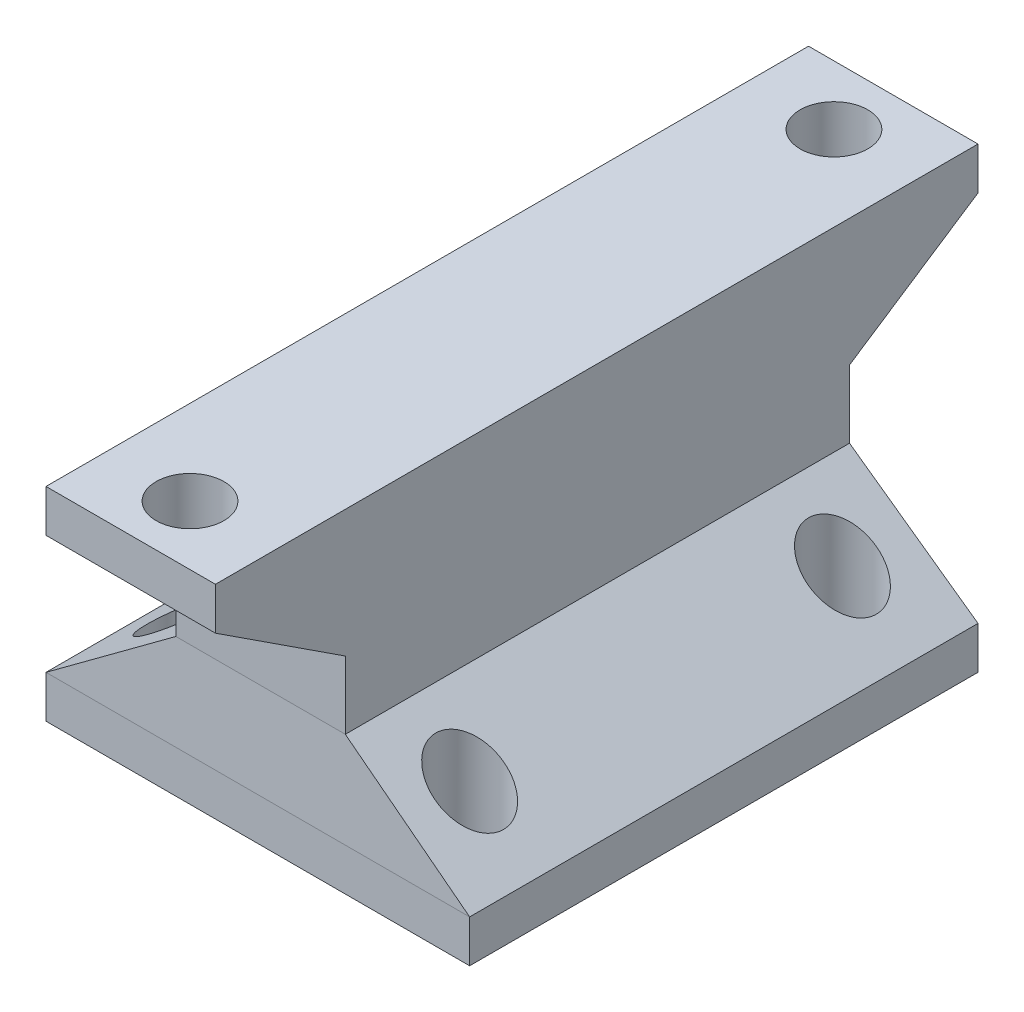
ISO-10303-21;
HEADER;
FILE_DESCRIPTION(('STEP AP214'),'2;1');
FILE_NAME('part.step','',(''),(''),'','','');
FILE_SCHEMA(('AUTOMOTIVE_DESIGN { 1 0 10303 214 1 1 1 1 }'));
ENDSEC;
DATA;
#1=APPLICATION_CONTEXT('core data for automotive mechanical design processes');
#2=APPLICATION_PROTOCOL_DEFINITION('international standard','automotive_design',2000,#1);
#3=PRODUCT_CONTEXT('',#1,'mechanical');
#4=PRODUCT('Part','Part','',(#3));
#5=PRODUCT_RELATED_PRODUCT_CATEGORY('part','',(#4));
#6=PRODUCT_DEFINITION_FORMATION('','',#4);
#7=PRODUCT_DEFINITION_CONTEXT('part definition',#1,'design');
#8=PRODUCT_DEFINITION('design','',#6,#7);
#9=PRODUCT_DEFINITION_SHAPE('','',#8);
#10=(LENGTH_UNIT() NAMED_UNIT(*) SI_UNIT(.MILLI.,.METRE.));
#11=(NAMED_UNIT(*) PLANE_ANGLE_UNIT() SI_UNIT($,.RADIAN.));
#12=(NAMED_UNIT(*) SI_UNIT($,.STERADIAN.) SOLID_ANGLE_UNIT());
#13=UNCERTAINTY_MEASURE_WITH_UNIT(LENGTH_MEASURE(1.E-05),#10,'distance_accuracy_value','');
#14=(GEOMETRIC_REPRESENTATION_CONTEXT(3) GLOBAL_UNCERTAINTY_ASSIGNED_CONTEXT((#13)) GLOBAL_UNIT_ASSIGNED_CONTEXT((#10,
#11,#12)) REPRESENTATION_CONTEXT('',''));
#15=CARTESIAN_POINT('',(0.,0.,0.));
#16=DIRECTION('',(0.,0.,1.));
#17=DIRECTION('',(1.,0.,0.));
#18=AXIS2_PLACEMENT_3D('',#15,#16,#17);
#19=CARTESIAN_POINT('',(-25.,-33.999664598733,-30.));
#20=DIRECTION('',(1.,0.,0.));
#21=DIRECTION('',(0.,0.,-1.));
#22=AXIS2_PLACEMENT_3D('',#19,#20,#21);
#23=PLANE('',#22);
#24=DIRECTION('',(0.,0.,-1.));
#25=VECTOR('',#24,1.);
#26=CARTESIAN_POINT('',(-25.,-28.999664598733,-30.));
#27=LINE('',#26,#25);
#28=CARTESIAN_POINT('',(-25.,-28.999664598733,30.));
#29=VERTEX_POINT('',#28);
#30=CARTESIAN_POINT('',(-25.,-28.999664598733,-30.));
#31=VERTEX_POINT('',#30);
#32=EDGE_CURVE('E90',#29,#31,#27,.T.);
#33=ORIENTED_EDGE('',*,*,#32,.T.);
#34=DIRECTION('',(0.,1.,0.));
#35=VECTOR('',#34,1.);
#36=CARTESIAN_POINT('',(-25.,-33.999664598733,-30.));
#37=LINE('',#36,#35);
#38=CARTESIAN_POINT('',(-25.,-33.999664598733,-30.));
#39=VERTEX_POINT('',#38);
#40=EDGE_CURVE('E12',#39,#31,#37,.T.);
#41=ORIENTED_EDGE('',*,*,#40,.F.);
#42=DIRECTION('',(0.,0.,-1.));
#43=VECTOR('',#42,1.);
#44=CARTESIAN_POINT('',(-25.,-33.999664598733,-30.));
#45=LINE('',#44,#43);
#46=CARTESIAN_POINT('',(-25.,-33.999664598733,30.));
#47=VERTEX_POINT('',#46);
#48=EDGE_CURVE('E120',#47,#39,#45,.T.);
#49=ORIENTED_EDGE('',*,*,#48,.F.);
#50=DIRECTION('',(0.,1.,0.));
#51=VECTOR('',#50,1.);
#52=CARTESIAN_POINT('',(-25.,-33.999664598733,30.));
#53=LINE('',#52,#51);
#54=EDGE_CURVE('E136',#47,#29,#53,.T.);
#55=ORIENTED_EDGE('',*,*,#54,.T.);
#56=EDGE_LOOP('',(#33,#41,#49,#55));
#57=FACE_BOUND('',#56,.T.);
#58=ADVANCED_FACE('F46',(#57),#23,.F.);
#59=CARTESIAN_POINT('',(25.,-33.999664598733,-30.));
#60=DIRECTION('',(0.,0.,1.));
#61=DIRECTION('',(0.,-1.,0.));
#62=AXIS2_PLACEMENT_3D('',#59,#60,#61);
#63=PLANE('',#62);
#64=DIRECTION('',(1.,0.,0.));
#65=VECTOR('',#64,1.);
#66=CARTESIAN_POINT('',(25.,-28.999664598733,-30.));
#67=LINE('',#66,#65);
#68=CARTESIAN_POINT('',(25.,-28.999664598733,-30.));
#69=VERTEX_POINT('',#68);
#70=EDGE_CURVE('E128',#31,#69,#67,.T.);
#71=ORIENTED_EDGE('',*,*,#70,.T.);
#72=DIRECTION('',(0.,1.,0.));
#73=VECTOR('',#72,1.);
#74=CARTESIAN_POINT('',(25.,-33.999664598733,-30.));
#75=LINE('',#74,#73);
#76=CARTESIAN_POINT('',(25.,-33.999664598733,-30.));
#77=VERTEX_POINT('',#76);
#78=EDGE_CURVE('E55',#77,#69,#75,.T.);
#79=ORIENTED_EDGE('',*,*,#78,.F.);
#80=DIRECTION('',(1.,0.,0.));
#81=VECTOR('',#80,1.);
#82=CARTESIAN_POINT('',(25.,-33.999664598733,-30.));
#83=LINE('',#82,#81);
#84=EDGE_CURVE('E113',#39,#77,#83,.T.);
#85=ORIENTED_EDGE('',*,*,#84,.F.);
#86=ORIENTED_EDGE('',*,*,#40,.T.);
#87=EDGE_LOOP('',(#71,#79,#85,#86));
#88=FACE_BOUND('',#87,.T.);
#89=ADVANCED_FACE('F126',(#88),#63,.F.);
#90=CARTESIAN_POINT('',(25.,-33.999664598733,-30.));
#91=DIRECTION('',(-1.,0.,0.));
#92=DIRECTION('',(0.,0.,1.));
#93=AXIS2_PLACEMENT_3D('',#90,#91,#92);
#94=PLANE('',#93);
#95=DIRECTION('',(0.,0.,1.));
#96=VECTOR('',#95,1.);
#97=CARTESIAN_POINT('',(25.,-28.999664598733,-30.));
#98=LINE('',#97,#96);
#99=CARTESIAN_POINT('',(25.,-28.999664598733,30.));
#100=VERTEX_POINT('',#99);
#101=EDGE_CURVE('E146',#69,#100,#98,.T.);
#102=ORIENTED_EDGE('',*,*,#101,.T.);
#103=DIRECTION('',(0.,1.,0.));
#104=VECTOR('',#103,1.);
#105=CARTESIAN_POINT('',(25.,-33.999664598733,30.));
#106=LINE('',#105,#104);
#107=CARTESIAN_POINT('',(25.,-33.999664598733,30.));
#108=VERTEX_POINT('',#107);
#109=EDGE_CURVE('E131',#108,#100,#106,.T.);
#110=ORIENTED_EDGE('',*,*,#109,.F.);
#111=DIRECTION('',(0.,0.,1.));
#112=VECTOR('',#111,1.);
#113=CARTESIAN_POINT('',(25.,-33.999664598733,-30.));
#114=LINE('',#113,#112);
#115=EDGE_CURVE('E117',#77,#108,#114,.T.);
#116=ORIENTED_EDGE('',*,*,#115,.F.);
#117=ORIENTED_EDGE('',*,*,#78,.T.);
#118=EDGE_LOOP('',(#102,#110,#116,#117));
#119=FACE_BOUND('',#118,.T.);
#120=ADVANCED_FACE('F133',(#119),#94,.F.);
#121=CARTESIAN_POINT('',(25.,-33.999664598733,30.));
#122=DIRECTION('',(0.,0.,-1.));
#123=DIRECTION('',(0.,1.,0.));
#124=AXIS2_PLACEMENT_3D('',#121,#122,#123);
#125=PLANE('',#124);
#126=DIRECTION('',(1.,0.,0.));
#127=VECTOR('',#126,1.);
#128=CARTESIAN_POINT('',(25.,-28.999664598733,30.));
#129=LINE('',#128,#127);
#130=EDGE_CURVE('E83',#100,#29,#129,.F.);
#131=ORIENTED_EDGE('',*,*,#130,.T.);
#132=ORIENTED_EDGE('',*,*,#54,.F.);
#133=DIRECTION('',(-1.,0.,0.));
#134=VECTOR('',#133,1.);
#135=CARTESIAN_POINT('',(25.,-33.999664598733,30.));
#136=LINE('',#135,#134);
#137=EDGE_CURVE('E64',#108,#47,#136,.T.);
#138=ORIENTED_EDGE('',*,*,#137,.F.);
#139=ORIENTED_EDGE('',*,*,#109,.T.);
#140=EDGE_LOOP('',(#131,#132,#138,#139));
#141=FACE_BOUND('',#140,.T.);
#142=ADVANCED_FACE('F398',(#141),#125,.F.);
#143=CARTESIAN_POINT('',(0.,-33.999664598733,0.));
#144=DIRECTION('',(0.,-1.,0.));
#145=DIRECTION('',(0.,0.,-1.));
#146=AXIS2_PLACEMENT_3D('',#143,#144,#145);
#147=PLANE('',#146);
#148=CARTESIAN_POINT('',(0.,-33.999664598733,0.));
#149=DIRECTION('',(0.,-1.,0.));
#150=DIRECTION('',(0.,0.,-1.));
#151=AXIS2_PLACEMENT_3D('',#148,#149,#150);
#152=CIRCLE('',#151,5.);
#153=CARTESIAN_POINT('',(0.,-33.999664598733,-5.00000000000001));
#154=VERTEX_POINT('',#153);
#155=EDGE_CURVE('E276',#154,#154,#152,.T.);
#156=ORIENTED_EDGE('',*,*,#155,.F.);
#157=EDGE_LOOP('',(#156));
#158=FACE_BOUND('',#157,.T.);
#159=CARTESIAN_POINT('',(17.,-33.999664598733,22.));
#160=DIRECTION('',(0.,-1.,0.));
#161=DIRECTION('',(0.,0.,-1.));
#162=AXIS2_PLACEMENT_3D('',#159,#160,#161);
#163=CIRCLE('',#162,4.);
#164=CARTESIAN_POINT('',(17.,-33.999664598733,18.));
#165=VERTEX_POINT('',#164);
#166=EDGE_CURVE('E221',#165,#165,#163,.F.);
#167=ORIENTED_EDGE('',*,*,#166,.T.);
#168=EDGE_LOOP('',(#167));
#169=FACE_BOUND('',#168,.T.);
#170=CARTESIAN_POINT('',(-17.,-33.999664598733,-22.));
#171=DIRECTION('',(0.,-1.,0.));
#172=DIRECTION('',(0.,0.,-1.));
#173=AXIS2_PLACEMENT_3D('',#170,#171,#172);
#174=CIRCLE('',#173,4.);
#175=CARTESIAN_POINT('',(-17.,-33.999664598733,-26.));
#176=VERTEX_POINT('',#175);
#177=EDGE_CURVE('E254',#176,#176,#174,.F.);
#178=ORIENTED_EDGE('',*,*,#177,.T.);
#179=EDGE_LOOP('',(#178));
#180=FACE_BOUND('',#179,.T.);
#181=CARTESIAN_POINT('',(17.,-33.999664598733,-22.));
#182=DIRECTION('',(0.,-1.,0.));
#183=DIRECTION('',(0.,0.,-1.));
#184=AXIS2_PLACEMENT_3D('',#181,#182,#183);
#185=CIRCLE('',#184,4.);
#186=CARTESIAN_POINT('',(17.,-33.999664598733,-26.));
#187=VERTEX_POINT('',#186);
#188=EDGE_CURVE('E258',#187,#187,#185,.F.);
#189=ORIENTED_EDGE('',*,*,#188,.T.);
#190=EDGE_LOOP('',(#189));
#191=FACE_BOUND('',#190,.T.);
#192=CARTESIAN_POINT('',(-17.0800073454085,-33.999664598733,22.));
#193=DIRECTION('',(0.,-1.,0.));
#194=DIRECTION('',(0.,0.,-1.));
#195=AXIS2_PLACEMENT_3D('',#192,#193,#194);
#196=CIRCLE('',#195,4.);
#197=CARTESIAN_POINT('',(-17.0800073454085,-33.999664598733,18.));
#198=VERTEX_POINT('',#197);
#199=EDGE_CURVE('E250',#198,#198,#196,.F.);
#200=ORIENTED_EDGE('',*,*,#199,.T.);
#201=EDGE_LOOP('',(#200));
#202=FACE_BOUND('',#201,.T.);
#203=ORIENTED_EDGE('',*,*,#48,.T.);
#204=ORIENTED_EDGE('',*,*,#84,.T.);
#205=ORIENTED_EDGE('',*,*,#115,.T.);
#206=ORIENTED_EDGE('',*,*,#137,.T.);
#207=EDGE_LOOP('',(#203,#204,#205,#206));
#208=FACE_BOUND('',#207,.T.);
#209=ADVANCED_FACE('F115',(#158,#169,#180,#191,#202,#208),#147,.T.);
#210=CARTESIAN_POINT('',(-5.08654525662122,-6.93619807721076,0.));
#211=DIRECTION('',(0.591363663627518,0.806404995855706,0.));
#212=DIRECTION('',(-0.806404995855706,0.591363663627518,0.));
#213=AXIS2_PLACEMENT_3D('',#210,#211,#212);
#214=PLANE('',#213);
#215=CARTESIAN_POINT('',(17.,-23.1329979320663,22.));
#216=DIRECTION('',(0.591363663627518,0.806404995855706,0.));
#217=DIRECTION('',(-0.806404995855706,0.591363663627518,0.));
#218=AXIS2_PLACEMENT_3D('',#215,#216,#217);
#219=ELLIPSE('',#218,4.96028673006354,4.);
#220=CARTESIAN_POINT('',(13.,-20.199664598733,22.));
#221=VERTEX_POINT('',#220);
#222=EDGE_CURVE('E259',#221,#221,#219,.F.);
#223=ORIENTED_EDGE('',*,*,#222,.T.);
#224=EDGE_LOOP('',(#223));
#225=FACE_BOUND('',#224,.T.);
#226=CARTESIAN_POINT('',(17.,-23.1329979320663,-22.));
#227=DIRECTION('',(0.591363663627518,0.806404995855706,0.));
#228=DIRECTION('',(-0.806404995855706,0.591363663627518,0.));
#229=AXIS2_PLACEMENT_3D('',#226,#227,#228);
#230=ELLIPSE('',#229,4.96028673006354,4.);
#231=CARTESIAN_POINT('',(13.,-20.199664598733,-22.));
#232=VERTEX_POINT('',#231);
#233=EDGE_CURVE('E255',#232,#232,#230,.F.);
#234=ORIENTED_EDGE('',*,*,#233,.T.);
#235=EDGE_LOOP('',(#234));
#236=FACE_BOUND('',#235,.T.);
#237=DIRECTION('',(-0.806373726930303,0.591340733082223,0.00880624291693662));
#238=VECTOR('',#237,1.);
#239=CARTESIAN_POINT('',(25.,-28.999664598733,-30.));
#240=LINE('',#239,#238);
#241=CARTESIAN_POINT('',(10.,-17.999664598733,-29.8361880610162));
#242=VERTEX_POINT('',#241);
#243=EDGE_CURVE('E330',#69,#242,#240,.T.);
#244=ORIENTED_EDGE('',*,*,#243,.T.);
#245=DIRECTION('',(0.,0.,1.));
#246=VECTOR('',#245,1.);
#247=CARTESIAN_POINT('',(10.,-17.999664598733,29.672384363304));
#248=LINE('',#247,#246);
#249=CARTESIAN_POINT('',(10.,-17.999664598733,29.672384363304));
#250=VERTEX_POINT('',#249);
#251=EDGE_CURVE('E240',#242,#250,#248,.T.);
#252=ORIENTED_EDGE('',*,*,#251,.T.);
#253=DIRECTION('',(-0.806279948263967,0.591271962060243,-0.0176099945737157));
#254=VECTOR('',#253,1.);
#255=CARTESIAN_POINT('',(25.,-28.999664598733,30.));
#256=LINE('',#255,#254);
#257=EDGE_CURVE('E334',#100,#250,#256,.T.);
#258=ORIENTED_EDGE('',*,*,#257,.F.);
#259=ORIENTED_EDGE('',*,*,#101,.F.);
#260=EDGE_LOOP('',(#244,#252,#258,#259));
#261=FACE_BOUND('',#260,.T.);
#262=ADVANCED_FACE('F366',(#225,#236,#261),#214,.T.);
#263=CARTESIAN_POINT('',(0.,0.86700422025204,29.1104738435345));
#264=DIRECTION('',(0.,-0.0297700389983371,-0.999556774164448));
#265=DIRECTION('',(0.,0.999556774164448,-0.0297700389983371));
#266=AXIS2_PLACEMENT_3D('',#263,#264,#265);
#267=PLANE('',#266);
#268=ORIENTED_EDGE('',*,*,#257,.T.);
#269=DIRECTION('',(-1.,0.,0.));
#270=VECTOR('',#269,1.);
#271=CARTESIAN_POINT('',(-9.99999999999999,-17.999664598733,29.672384363304));
#272=LINE('',#271,#270);
#273=CARTESIAN_POINT('',(-9.99999999999999,-17.999664598733,29.672384363304));
#274=VERTEX_POINT('',#273);
#275=EDGE_CURVE('E144',#250,#274,#272,.T.);
#276=ORIENTED_EDGE('',*,*,#275,.T.);
#277=DIRECTION('',(0.806279948263967,0.591271962060242,-0.0176099945737157));
#278=VECTOR('',#277,1.);
#279=CARTESIAN_POINT('',(-25.,-28.999664598733,30.));
#280=LINE('',#279,#278);
#281=EDGE_CURVE('E228',#29,#274,#280,.T.);
#282=ORIENTED_EDGE('',*,*,#281,.F.);
#283=ORIENTED_EDGE('',*,*,#130,.F.);
#284=EDGE_LOOP('',(#268,#276,#282,#283));
#285=FACE_BOUND('',#284,.T.);
#286=ADVANCED_FACE('F355',(#285),#267,.F.);
#287=CARTESIAN_POINT('',(0.,0.440230903842354,-29.5615812394766));
#288=DIRECTION('',(0.,-0.0148903434177175,0.999889132690671));
#289=DIRECTION('',(0.,-0.999889132690671,-0.0148903434177175));
#290=AXIS2_PLACEMENT_3D('',#287,#288,#289);
#291=PLANE('',#290);
#292=DIRECTION('',(0.806373726930304,0.591340733082222,0.00880624291693661));
#293=VECTOR('',#292,1.);
#294=CARTESIAN_POINT('',(-25.,-28.999664598733,-30.));
#295=LINE('',#294,#293);
#296=CARTESIAN_POINT('',(-9.99999999999999,-17.999664598733,-29.8361880610162));
#297=VERTEX_POINT('',#296);
#298=EDGE_CURVE('E331',#31,#297,#295,.T.);
#299=ORIENTED_EDGE('',*,*,#298,.T.);
#300=DIRECTION('',(1.,0.,0.));
#301=VECTOR('',#300,1.);
#302=CARTESIAN_POINT('',(-9.99999999999999,-17.999664598733,-29.8361880610162));
#303=LINE('',#302,#301);
#304=EDGE_CURVE('E163',#297,#242,#303,.T.);
#305=ORIENTED_EDGE('',*,*,#304,.T.);
#306=ORIENTED_EDGE('',*,*,#243,.F.);
#307=ORIENTED_EDGE('',*,*,#70,.F.);
#308=EDGE_LOOP('',(#299,#305,#306,#307));
#309=FACE_BOUND('',#308,.T.);
#310=ADVANCED_FACE('F365',(#309),#291,.F.);
#311=CARTESIAN_POINT('',(5.08654525662123,-6.93619807721077,0.));
#312=DIRECTION('',(-0.591363663627517,0.806404995855706,0.));
#313=DIRECTION('',(-0.806404995855706,-0.591363663627517,0.));
#314=AXIS2_PLACEMENT_3D('',#311,#312,#313);
#315=PLANE('',#314);
#316=CARTESIAN_POINT('',(-17.,-23.1329979320663,-22.));
#317=DIRECTION('',(-0.591363663627517,0.806404995855706,0.));
#318=DIRECTION('',(0.806404995855706,0.591363663627517,0.));
#319=AXIS2_PLACEMENT_3D('',#316,#317,#318);
#320=ELLIPSE('',#319,4.96028673006354,4.);
#321=CARTESIAN_POINT('',(-13.,-20.199664598733,-22.));
#322=VERTEX_POINT('',#321);
#323=EDGE_CURVE('E251',#322,#322,#320,.F.);
#324=ORIENTED_EDGE('',*,*,#323,.T.);
#325=EDGE_LOOP('',(#324));
#326=FACE_BOUND('',#325,.T.);
#327=CARTESIAN_POINT('',(-17.0800073454085,-23.1916699853659,22.));
#328=DIRECTION('',(-0.591363663627517,0.806404995855706,0.));
#329=DIRECTION('',(0.806404995855706,0.591363663627517,0.));
#330=AXIS2_PLACEMENT_3D('',#327,#328,#329);
#331=ELLIPSE('',#330,4.96028673006354,4.);
#332=CARTESIAN_POINT('',(-13.0800073454085,-20.2583366520325,22.));
#333=VERTEX_POINT('',#332);
#334=EDGE_CURVE('E247',#333,#333,#331,.F.);
#335=ORIENTED_EDGE('',*,*,#334,.T.);
#336=EDGE_LOOP('',(#335));
#337=FACE_BOUND('',#336,.T.);
#338=ORIENTED_EDGE('',*,*,#281,.T.);
#339=DIRECTION('',(0.,0.,-1.));
#340=VECTOR('',#339,1.);
#341=CARTESIAN_POINT('',(-9.99999999999999,-17.999664598733,29.672384363304));
#342=LINE('',#341,#340);
#343=EDGE_CURVE('E224',#274,#297,#342,.T.);
#344=ORIENTED_EDGE('',*,*,#343,.T.);
#345=ORIENTED_EDGE('',*,*,#298,.F.);
#346=ORIENTED_EDGE('',*,*,#32,.F.);
#347=EDGE_LOOP('',(#338,#344,#345,#346));
#348=FACE_BOUND('',#347,.T.);
#349=ADVANCED_FACE('F371',(#326,#337,#348),#315,.T.);
#350=CARTESIAN_POINT('',(10.,5.,-45.));
#351=DIRECTION('',(-1.,0.,0.));
#352=DIRECTION('',(0.,0.,1.));
#353=AXIS2_PLACEMENT_3D('',#350,#351,#352);
#354=PLANE('',#353);
#355=DIRECTION('',(0.,-1.,0.));
#356=VECTOR('',#355,1.);
#357=CARTESIAN_POINT('',(10.,5.,45.));
#358=LINE('',#357,#356);
#359=CARTESIAN_POINT('',(10.,5.,45.));
#360=VERTEX_POINT('',#359);
#361=CARTESIAN_POINT('',(10.,0.,45.));
#362=VERTEX_POINT('',#361);
#363=EDGE_CURVE('E314',#360,#362,#358,.T.);
#364=ORIENTED_EDGE('',*,*,#363,.T.);
#365=DIRECTION('',(0.,0.546397868702243,0.8375257423373));
#366=VECTOR('',#365,1.);
#367=CARTESIAN_POINT('',(10.,-20.5930026268364,13.4347783915059));
#368=LINE('',#367,#366);
#369=CARTESIAN_POINT('',(10.,-9.999664598733,29.672384363304));
#370=VERTEX_POINT('',#369);
#371=EDGE_CURVE('E290',#370,#362,#368,.T.);
#372=ORIENTED_EDGE('',*,*,#371,.F.);
#373=DIRECTION('',(0.,1.,0.));
#374=VECTOR('',#373,1.);
#375=CARTESIAN_POINT('',(10.,-17.999664598733,29.672384363304));
#376=LINE('',#375,#374);
#377=EDGE_CURVE('E153',#250,#370,#376,.T.);
#378=ORIENTED_EDGE('',*,*,#377,.F.);
#379=ORIENTED_EDGE('',*,*,#251,.F.);
#380=DIRECTION('',(0.,1.,0.));
#381=VECTOR('',#380,1.);
#382=CARTESIAN_POINT('',(10.,-17.999664598733,-29.8361880610162));
#383=LINE('',#382,#381);
#384=CARTESIAN_POINT('',(10.,-9.99966459873298,-29.8361880610162));
#385=VERTEX_POINT('',#384);
#386=EDGE_CURVE('E149',#242,#385,#383,.T.);
#387=ORIENTED_EDGE('',*,*,#386,.T.);
#388=DIRECTION('',(0.,0.550518069630228,-0.834823247766021));
#389=VECTOR('',#388,1.);
#390=CARTESIAN_POINT('',(10.,-20.6813377279164,-13.6381565245227));
#391=LINE('',#390,#389);
#392=CARTESIAN_POINT('',(10.,0.,-45.));
#393=VERTEX_POINT('',#392);
#394=EDGE_CURVE('E294',#385,#393,#391,.T.);
#395=ORIENTED_EDGE('',*,*,#394,.T.);
#396=DIRECTION('',(0.,-1.,0.));
#397=VECTOR('',#396,1.);
#398=CARTESIAN_POINT('',(10.,5.,-45.));
#399=LINE('',#398,#397);
#400=CARTESIAN_POINT('',(10.,5.,-45.));
#401=VERTEX_POINT('',#400);
#402=EDGE_CURVE('E327',#401,#393,#399,.T.);
#403=ORIENTED_EDGE('',*,*,#402,.F.);
#404=DIRECTION('',(0.,0.,-1.));
#405=VECTOR('',#404,1.);
#406=CARTESIAN_POINT('',(10.,5.,-45.));
#407=LINE('',#406,#405);
#408=EDGE_CURVE('E305',#360,#401,#407,.T.);
#409=ORIENTED_EDGE('',*,*,#408,.F.);
#410=EDGE_LOOP('',(#364,#372,#378,#379,#387,#395,#403,#409));
#411=FACE_BOUND('',#410,.T.);
#412=ADVANCED_FACE('F443',(#411),#354,.F.);
#413=CARTESIAN_POINT('',(-10.,5.,-45.));
#414=DIRECTION('',(0.,0.,1.));
#415=DIRECTION('',(1.,0.,0.));
#416=AXIS2_PLACEMENT_3D('',#413,#414,#415);
#417=PLANE('',#416);
#418=DIRECTION('',(-1.,0.,0.));
#419=VECTOR('',#418,1.);
#420=CARTESIAN_POINT('',(-10.,0.,-45.));
#421=LINE('',#420,#419);
#422=CARTESIAN_POINT('',(-10.,0.,-45.));
#423=VERTEX_POINT('',#422);
#424=EDGE_CURVE('E302',#393,#423,#421,.T.);
#425=ORIENTED_EDGE('',*,*,#424,.T.);
#426=DIRECTION('',(0.,-1.,0.));
#427=VECTOR('',#426,1.);
#428=CARTESIAN_POINT('',(-10.,5.,-45.));
#429=LINE('',#428,#427);
#430=CARTESIAN_POINT('',(-10.,5.,-45.));
#431=VERTEX_POINT('',#430);
#432=EDGE_CURVE('E324',#431,#423,#429,.T.);
#433=ORIENTED_EDGE('',*,*,#432,.F.);
#434=DIRECTION('',(-1.,0.,0.));
#435=VECTOR('',#434,1.);
#436=CARTESIAN_POINT('',(-10.,5.,-45.));
#437=LINE('',#436,#435);
#438=EDGE_CURVE('E307',#401,#431,#437,.T.);
#439=ORIENTED_EDGE('',*,*,#438,.F.);
#440=ORIENTED_EDGE('',*,*,#402,.T.);
#441=EDGE_LOOP('',(#425,#433,#439,#440));
#442=FACE_BOUND('',#441,.T.);
#443=ADVANCED_FACE('F203',(#442),#417,.F.);
#444=CARTESIAN_POINT('',(-10.,5.,-45.));
#445=DIRECTION('',(1.,0.,0.));
#446=DIRECTION('',(0.,0.,-1.));
#447=AXIS2_PLACEMENT_3D('',#444,#445,#446);
#448=PLANE('',#447);
#449=ORIENTED_EDGE('',*,*,#432,.T.);
#450=DIRECTION('',(0.,0.550518069630228,-0.834823247766021));
#451=VECTOR('',#450,1.);
#452=CARTESIAN_POINT('',(-9.99999999999999,-20.6813377279164,-13.6381565245227));
#453=LINE('',#452,#451);
#454=CARTESIAN_POINT('',(-10.,-9.99966459873298,-29.8361880610162));
#455=VERTEX_POINT('',#454);
#456=EDGE_CURVE('E287',#455,#423,#453,.T.);
#457=ORIENTED_EDGE('',*,*,#456,.F.);
#458=DIRECTION('',(0.,1.,0.));
#459=VECTOR('',#458,1.);
#460=CARTESIAN_POINT('',(-9.99999999999999,-17.999664598733,-29.8361880610162));
#461=LINE('',#460,#459);
#462=EDGE_CURVE('E152',#297,#455,#461,.T.);
#463=ORIENTED_EDGE('',*,*,#462,.F.);
#464=ORIENTED_EDGE('',*,*,#343,.F.);
#465=DIRECTION('',(0.,1.,0.));
#466=VECTOR('',#465,1.);
#467=CARTESIAN_POINT('',(-9.99999999999999,-17.999664598733,29.672384363304));
#468=LINE('',#467,#466);
#469=CARTESIAN_POINT('',(-9.99999999999999,-9.999664598733,29.672384363304));
#470=VERTEX_POINT('',#469);
#471=EDGE_CURVE('E213',#274,#470,#468,.T.);
#472=ORIENTED_EDGE('',*,*,#471,.T.);
#473=DIRECTION('',(0.,0.546397868702243,0.8375257423373));
#474=VECTOR('',#473,1.);
#475=CARTESIAN_POINT('',(-9.99999999999999,-20.5930026268364,13.4347783915059));
#476=LINE('',#475,#474);
#477=CARTESIAN_POINT('',(-9.99999999999999,0.,45.));
#478=VERTEX_POINT('',#477);
#479=EDGE_CURVE('E289',#470,#478,#476,.T.);
#480=ORIENTED_EDGE('',*,*,#479,.T.);
#481=DIRECTION('',(0.,-1.,0.));
#482=VECTOR('',#481,1.);
#483=CARTESIAN_POINT('',(-10.,5.,45.));
#484=LINE('',#483,#482);
#485=CARTESIAN_POINT('',(-10.,5.,45.));
#486=VERTEX_POINT('',#485);
#487=EDGE_CURVE('E321',#486,#478,#484,.T.);
#488=ORIENTED_EDGE('',*,*,#487,.F.);
#489=DIRECTION('',(0.,0.,1.));
#490=VECTOR('',#489,1.);
#491=CARTESIAN_POINT('',(-10.,5.,-45.));
#492=LINE('',#491,#490);
#493=EDGE_CURVE('E311',#431,#486,#492,.T.);
#494=ORIENTED_EDGE('',*,*,#493,.F.);
#495=EDGE_LOOP('',(#449,#457,#463,#464,#472,#480,#488,#494));
#496=FACE_BOUND('',#495,.T.);
#497=ADVANCED_FACE('F198',(#496),#448,.F.);
#498=CARTESIAN_POINT('',(-10.,5.,45.));
#499=DIRECTION('',(0.,0.,-1.));
#500=DIRECTION('',(-1.,0.,0.));
#501=AXIS2_PLACEMENT_3D('',#498,#499,#500);
#502=PLANE('',#501);
#503=DIRECTION('',(1.,0.,0.));
#504=VECTOR('',#503,1.);
#505=CARTESIAN_POINT('',(-10.,0.,45.));
#506=LINE('',#505,#504);
#507=EDGE_CURVE('E308',#478,#362,#506,.T.);
#508=ORIENTED_EDGE('',*,*,#507,.T.);
#509=ORIENTED_EDGE('',*,*,#363,.F.);
#510=DIRECTION('',(1.,0.,0.));
#511=VECTOR('',#510,1.);
#512=CARTESIAN_POINT('',(-10.,5.,45.));
#513=LINE('',#512,#511);
#514=EDGE_CURVE('E98',#486,#360,#513,.T.);
#515=ORIENTED_EDGE('',*,*,#514,.F.);
#516=ORIENTED_EDGE('',*,*,#487,.T.);
#517=EDGE_LOOP('',(#508,#509,#515,#516));
#518=FACE_BOUND('',#517,.T.);
#519=ADVANCED_FACE('F194',(#518),#502,.F.);
#520=CARTESIAN_POINT('',(0.,5.,0.));
#521=DIRECTION('',(0.,1.,0.));
#522=DIRECTION('',(0.,0.,1.));
#523=AXIS2_PLACEMENT_3D('',#520,#521,#522);
#524=PLANE('',#523);
#525=CARTESIAN_POINT('',(0.,5.,-38.));
#526=DIRECTION('',(0.,1.,0.));
#527=DIRECTION('',(0.,0.,1.));
#528=AXIS2_PLACEMENT_3D('',#525,#526,#527);
#529=CIRCLE('',#528,4.);
#530=CARTESIAN_POINT('',(0.,5.,-34.));
#531=VERTEX_POINT('',#530);
#532=EDGE_CURVE('E263',#531,#531,#529,.T.);
#533=ORIENTED_EDGE('',*,*,#532,.F.);
#534=EDGE_LOOP('',(#533));
#535=FACE_BOUND('',#534,.T.);
#536=CARTESIAN_POINT('',(0.,5.,38.));
#537=DIRECTION('',(0.,1.,0.));
#538=DIRECTION('',(0.,0.,1.));
#539=AXIS2_PLACEMENT_3D('',#536,#537,#538);
#540=CIRCLE('',#539,4.);
#541=CARTESIAN_POINT('',(0.,5.,42.));
#542=VERTEX_POINT('',#541);
#543=EDGE_CURVE('E268',#542,#542,#540,.T.);
#544=ORIENTED_EDGE('',*,*,#543,.F.);
#545=EDGE_LOOP('',(#544));
#546=FACE_BOUND('',#545,.T.);
#547=ORIENTED_EDGE('',*,*,#408,.T.);
#548=ORIENTED_EDGE('',*,*,#438,.T.);
#549=ORIENTED_EDGE('',*,*,#493,.T.);
#550=ORIENTED_EDGE('',*,*,#514,.T.);
#551=EDGE_LOOP('',(#547,#548,#549,#550));
#552=FACE_BOUND('',#551,.T.);
#553=ADVANCED_FACE('F187',(#535,#546,#552),#524,.T.);
#554=CARTESIAN_POINT('',(-9.99999999999999,-20.5930026268364,13.4347783915059));
#555=DIRECTION('',(0.,0.8375257423373,-0.546397868702243));
#556=DIRECTION('',(0.,0.546397868702243,0.8375257423373));
#557=AXIS2_PLACEMENT_3D('',#554,#555,#556);
#558=PLANE('',#557);
#559=CARTESIAN_POINT('',(0.,-4.56676719003501,38.));
#560=DIRECTION('',(0.,0.8375257423373,-0.546397868702243));
#561=DIRECTION('',(0.,0.546397868702243,0.8375257423373));
#562=AXIS2_PLACEMENT_3D('',#559,#560,#561);
#563=ELLIPSE('',#562,4.77597260334604,4.);
#564=CARTESIAN_POINT('',(0.,-1.95718593858643,42.));
#565=VERTEX_POINT('',#564);
#566=EDGE_CURVE('E49',#565,#565,#563,.T.);
#567=ORIENTED_EDGE('',*,*,#566,.T.);
#568=EDGE_LOOP('',(#567));
#569=FACE_BOUND('',#568,.T.);
#570=ORIENTED_EDGE('',*,*,#371,.T.);
#571=ORIENTED_EDGE('',*,*,#507,.F.);
#572=ORIENTED_EDGE('',*,*,#479,.F.);
#573=DIRECTION('',(1.,0.,0.));
#574=VECTOR('',#573,1.);
#575=CARTESIAN_POINT('',(-9.99999999999999,-9.999664598733,29.672384363304));
#576=LINE('',#575,#574);
#577=EDGE_CURVE('E299',#470,#370,#576,.T.);
#578=ORIENTED_EDGE('',*,*,#577,.T.);
#579=EDGE_LOOP('',(#570,#571,#572,#578));
#580=FACE_BOUND('',#579,.T.);
#581=ADVANCED_FACE('F184',(#569,#580),#558,.F.);
#582=CARTESIAN_POINT('',(-9.99999999999999,-20.6813377279164,-13.6381565245227));
#583=DIRECTION('',(0.,-0.834823247766021,-0.550518069630228));
#584=DIRECTION('',(0.,0.550518069630228,-0.834823247766021));
#585=AXIS2_PLACEMENT_3D('',#582,#583,#584);
#586=PLANE('',#585);
#587=CARTESIAN_POINT('',(0.,-4.61609867444859,-38.));
#588=DIRECTION('',(0.,-0.834823247766021,-0.550518069630228));
#589=DIRECTION('',(0.,0.550518069630228,-0.834823247766021));
#590=AXIS2_PLACEMENT_3D('',#587,#588,#589);
#591=ELLIPSE('',#590,4.79143340905271,4.);
#592=CARTESIAN_POINT('',(0.,-1.97832800333511,-42.));
#593=VERTEX_POINT('',#592);
#594=EDGE_CURVE('E261',#593,#593,#591,.T.);
#595=ORIENTED_EDGE('',*,*,#594,.F.);
#596=EDGE_LOOP('',(#595));
#597=FACE_BOUND('',#596,.T.);
#598=ORIENTED_EDGE('',*,*,#394,.F.);
#599=DIRECTION('',(1.,0.,0.));
#600=VECTOR('',#599,1.);
#601=CARTESIAN_POINT('',(-10.,-9.99966459873298,-29.8361880610162));
#602=LINE('',#601,#600);
#603=EDGE_CURVE('E293',#455,#385,#602,.T.);
#604=ORIENTED_EDGE('',*,*,#603,.F.);
#605=ORIENTED_EDGE('',*,*,#456,.T.);
#606=ORIENTED_EDGE('',*,*,#424,.F.);
#607=EDGE_LOOP('',(#598,#604,#605,#606));
#608=FACE_BOUND('',#607,.T.);
#609=ADVANCED_FACE('F181',(#597,#608),#586,.T.);
#610=CARTESIAN_POINT('',(-9.99999999999999,-17.999664598733,-29.8361880610162));
#611=DIRECTION('',(0.,0.,1.));
#612=DIRECTION('',(0.,-1.,0.));
#613=AXIS2_PLACEMENT_3D('',#610,#611,#612);
#614=PLANE('',#613);
#615=ORIENTED_EDGE('',*,*,#603,.T.);
#616=ORIENTED_EDGE('',*,*,#386,.F.);
#617=ORIENTED_EDGE('',*,*,#304,.F.);
#618=ORIENTED_EDGE('',*,*,#462,.T.);
#619=EDGE_LOOP('',(#615,#616,#617,#618));
#620=FACE_BOUND('',#619,.T.);
#621=ADVANCED_FACE('F170',(#620),#614,.F.);
#622=CARTESIAN_POINT('',(-9.99999999999999,-17.999664598733,29.672384363304));
#623=DIRECTION('',(0.,0.,-1.));
#624=DIRECTION('',(0.,1.,0.));
#625=AXIS2_PLACEMENT_3D('',#622,#623,#624);
#626=PLANE('',#625);
#627=ORIENTED_EDGE('',*,*,#577,.F.);
#628=ORIENTED_EDGE('',*,*,#471,.F.);
#629=ORIENTED_EDGE('',*,*,#275,.F.);
#630=ORIENTED_EDGE('',*,*,#377,.T.);
#631=EDGE_LOOP('',(#627,#628,#629,#630));
#632=FACE_BOUND('',#631,.T.);
#633=ADVANCED_FACE('F180',(#632),#626,.F.);
#634=CARTESIAN_POINT('',(-17.0800073454085,-43.999664598733,22.));
#635=DIRECTION('',(0.,1.,0.));
#636=DIRECTION('',(0.,0.,1.));
#637=AXIS2_PLACEMENT_3D('',#634,#635,#636);
#638=CYLINDRICAL_SURFACE('',#637,4.);
#639=ORIENTED_EDGE('',*,*,#199,.F.);
#640=EDGE_LOOP('',(#639));
#641=FACE_BOUND('',#640,.T.);
#642=ORIENTED_EDGE('',*,*,#334,.F.);
#643=EDGE_LOOP('',(#642));
#644=FACE_BOUND('',#643,.T.);
#645=ADVANCED_FACE('F488',(#641,#644),#638,.F.);
#646=CARTESIAN_POINT('',(-17.,-43.999664598733,-22.));
#647=DIRECTION('',(0.,1.,0.));
#648=DIRECTION('',(0.,0.,1.));
#649=AXIS2_PLACEMENT_3D('',#646,#647,#648);
#650=CYLINDRICAL_SURFACE('',#649,4.);
#651=ORIENTED_EDGE('',*,*,#177,.F.);
#652=EDGE_LOOP('',(#651));
#653=FACE_BOUND('',#652,.T.);
#654=ORIENTED_EDGE('',*,*,#323,.F.);
#655=EDGE_LOOP('',(#654));
#656=FACE_BOUND('',#655,.T.);
#657=ADVANCED_FACE('F509',(#653,#656),#650,.F.);
#658=CARTESIAN_POINT('',(17.,-43.999664598733,-22.));
#659=DIRECTION('',(0.,1.,0.));
#660=DIRECTION('',(0.,0.,1.));
#661=AXIS2_PLACEMENT_3D('',#658,#659,#660);
#662=CYLINDRICAL_SURFACE('',#661,4.);
#663=ORIENTED_EDGE('',*,*,#188,.F.);
#664=EDGE_LOOP('',(#663));
#665=FACE_BOUND('',#664,.T.);
#666=ORIENTED_EDGE('',*,*,#233,.F.);
#667=EDGE_LOOP('',(#666));
#668=FACE_BOUND('',#667,.T.);
#669=ADVANCED_FACE('F518',(#665,#668),#662,.F.);
#670=CARTESIAN_POINT('',(17.,-43.999664598733,22.));
#671=DIRECTION('',(0.,1.,0.));
#672=DIRECTION('',(0.,0.,1.));
#673=AXIS2_PLACEMENT_3D('',#670,#671,#672);
#674=CYLINDRICAL_SURFACE('',#673,4.);
#675=ORIENTED_EDGE('',*,*,#166,.F.);
#676=EDGE_LOOP('',(#675));
#677=FACE_BOUND('',#676,.T.);
#678=ORIENTED_EDGE('',*,*,#222,.F.);
#679=EDGE_LOOP('',(#678));
#680=FACE_BOUND('',#679,.T.);
#681=ADVANCED_FACE('F528',(#677,#680),#674,.F.);
#682=CARTESIAN_POINT('',(0.,-15.,-38.));
#683=DIRECTION('',(0.,1.,0.));
#684=DIRECTION('',(0.,0.,1.));
#685=AXIS2_PLACEMENT_3D('',#682,#683,#684);
#686=CYLINDRICAL_SURFACE('',#685,4.);
#687=ORIENTED_EDGE('',*,*,#594,.T.);
#688=EDGE_LOOP('',(#687));
#689=FACE_BOUND('',#688,.T.);
#690=ORIENTED_EDGE('',*,*,#532,.T.);
#691=EDGE_LOOP('',(#690));
#692=FACE_BOUND('',#691,.T.);
#693=ADVANCED_FACE('F538',(#689,#692),#686,.F.);
#694=CARTESIAN_POINT('',(0.,-15.,38.));
#695=DIRECTION('',(0.,1.,0.));
#696=DIRECTION('',(0.,0.,1.));
#697=AXIS2_PLACEMENT_3D('',#694,#695,#696);
#698=CYLINDRICAL_SURFACE('',#697,4.);
#699=ORIENTED_EDGE('',*,*,#543,.T.);
#700=EDGE_LOOP('',(#699));
#701=FACE_BOUND('',#700,.T.);
#702=ORIENTED_EDGE('',*,*,#566,.F.);
#703=EDGE_LOOP('',(#702));
#704=FACE_BOUND('',#703,.T.);
#705=ADVANCED_FACE('F564',(#701,#704),#698,.F.);
#706=CARTESIAN_POINT('',(0.,-31.999664598733,0.));
#707=DIRECTION('',(0.,-1.,0.));
#708=DIRECTION('',(0.,0.,-1.));
#709=AXIS2_PLACEMENT_3D('',#706,#707,#708);
#710=CYLINDRICAL_SURFACE('',#709,5.);
#711=CARTESIAN_POINT('',(0.,-31.999664598733,0.));
#712=DIRECTION('',(0.,-1.,0.));
#713=DIRECTION('',(0.,0.,-1.));
#714=AXIS2_PLACEMENT_3D('',#711,#712,#713);
#715=CIRCLE('',#714,5.);
#716=CARTESIAN_POINT('',(0.,-31.999664598733,-5.00000000000001));
#717=VERTEX_POINT('',#716);
#718=EDGE_CURVE('E273',#717,#717,#715,.T.);
#719=ORIENTED_EDGE('',*,*,#718,.F.);
#720=EDGE_LOOP('',(#719));
#721=FACE_BOUND('',#720,.T.);
#722=ORIENTED_EDGE('',*,*,#155,.T.);
#723=EDGE_LOOP('',(#722));
#724=FACE_BOUND('',#723,.T.);
#725=ADVANCED_FACE('F573',(#721,#724),#710,.F.);
#726=CARTESIAN_POINT('',(0.,-31.999664598733,0.));
#727=DIRECTION('',(0.,-1.,0.));
#728=DIRECTION('',(0.,0.,-1.));
#729=AXIS2_PLACEMENT_3D('',#726,#727,#728);
#730=PLANE('',#729);
#731=ORIENTED_EDGE('',*,*,#718,.T.);
#732=EDGE_LOOP('',(#731));
#733=FACE_BOUND('',#732,.T.);
#734=ADVANCED_FACE('F588',(#733),#730,.T.);
#735=CLOSED_SHELL('',(#58,#89,#120,#142,#209,#262,#286,#310,#349,#412,#443,#497,#519,#553,#581,
#609,#621,#633,#645,#657,#669,#681,#693,#705,#725,#734));
#736=MANIFOLD_SOLID_BREP('B2',#735);
#737=ADVANCED_BREP_SHAPE_REPRESENTATION('',(#18,#736),#14);
#738=SHAPE_DEFINITION_REPRESENTATION(#9,#737);
ENDSEC;
END-ISO-10303-21;
